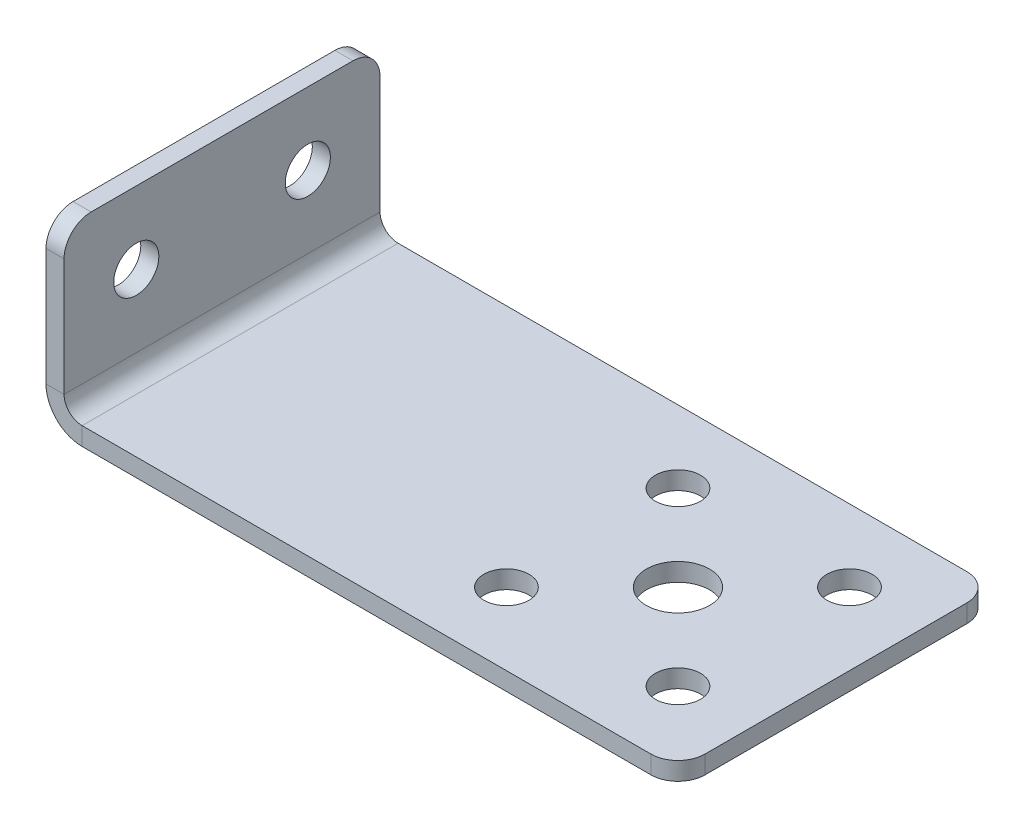
ISO-10303-21;
HEADER;
FILE_DESCRIPTION(('STEP AP214'),'2;1');
FILE_NAME('part.step','',(''),(''),'','','');
FILE_SCHEMA(('AUTOMOTIVE_DESIGN { 1 0 10303 214 1 1 1 1 }'));
ENDSEC;
DATA;
#1=APPLICATION_CONTEXT('core data for automotive mechanical design processes');
#2=APPLICATION_PROTOCOL_DEFINITION('international standard','automotive_design',2000,#1);
#3=PRODUCT_CONTEXT('',#1,'mechanical');
#4=PRODUCT('Part','Part','',(#3));
#5=PRODUCT_RELATED_PRODUCT_CATEGORY('part','',(#4));
#6=PRODUCT_DEFINITION_FORMATION('','',#4);
#7=PRODUCT_DEFINITION_CONTEXT('part definition',#1,'design');
#8=PRODUCT_DEFINITION('design','',#6,#7);
#9=PRODUCT_DEFINITION_SHAPE('','',#8);
#10=(LENGTH_UNIT() NAMED_UNIT(*) SI_UNIT(.MILLI.,.METRE.));
#11=(NAMED_UNIT(*) PLANE_ANGLE_UNIT() SI_UNIT($,.RADIAN.));
#12=(NAMED_UNIT(*) SI_UNIT($,.STERADIAN.) SOLID_ANGLE_UNIT());
#13=UNCERTAINTY_MEASURE_WITH_UNIT(LENGTH_MEASURE(1.E-05),#10,'distance_accuracy_value','');
#14=(GEOMETRIC_REPRESENTATION_CONTEXT(3) GLOBAL_UNCERTAINTY_ASSIGNED_CONTEXT((#13)) GLOBAL_UNIT_ASSIGNED_CONTEXT((#10,
#11,#12)) REPRESENTATION_CONTEXT('',''));
#15=CARTESIAN_POINT('',(0.,0.,0.));
#16=DIRECTION('',(0.,0.,1.));
#17=DIRECTION('',(1.,0.,0.));
#18=AXIS2_PLACEMENT_3D('',#15,#16,#17);
#19=CARTESIAN_POINT('',(35.,2.,17.5));
#20=DIRECTION('',(0.,0.,-1.));
#21=DIRECTION('',(-1.,0.,0.));
#22=AXIS2_PLACEMENT_3D('',#19,#20,#21);
#23=PLANE('',#22);
#24=DIRECTION('',(1.,0.,0.));
#25=VECTOR('',#24,1.);
#26=CARTESIAN_POINT('',(35.,0.,17.5));
#27=LINE('',#26,#25);
#28=CARTESIAN_POINT('',(-31.,0.,17.5));
#29=VERTEX_POINT('',#28);
#30=CARTESIAN_POINT('',(32.,0.,17.5));
#31=VERTEX_POINT('',#30);
#32=EDGE_CURVE('E225',#29,#31,#27,.T.);
#33=ORIENTED_EDGE('',*,*,#32,.T.);
#34=DIRECTION('',(0.,-1.,0.));
#35=VECTOR('',#34,1.);
#36=CARTESIAN_POINT('',(32.,2.,17.5));
#37=LINE('',#36,#35);
#38=CARTESIAN_POINT('',(32.,2.,17.5));
#39=VERTEX_POINT('',#38);
#40=EDGE_CURVE('E13',#31,#39,#37,.F.);
#41=ORIENTED_EDGE('',*,*,#40,.T.);
#42=DIRECTION('',(1.,0.,0.));
#43=VECTOR('',#42,1.);
#44=CARTESIAN_POINT('',(35.,2.,17.5));
#45=LINE('',#44,#43);
#46=CARTESIAN_POINT('',(-31.,2.,17.5));
#47=VERTEX_POINT('',#46);
#48=EDGE_CURVE('E228',#47,#39,#45,.T.);
#49=ORIENTED_EDGE('',*,*,#48,.F.);
#50=DIRECTION('',(0.,-1.,0.));
#51=VECTOR('',#50,1.);
#52=CARTESIAN_POINT('',(-31.,2.,17.5));
#53=LINE('',#52,#51);
#54=EDGE_CURVE('E210',#47,#29,#53,.T.);
#55=ORIENTED_EDGE('',*,*,#54,.T.);
#56=EDGE_LOOP('',(#33,#41,#49,#55));
#57=FACE_BOUND('',#56,.T.);
#58=ADVANCED_FACE('F65',(#57),#23,.F.);
#59=CARTESIAN_POINT('',(35.,2.,-17.5));
#60=DIRECTION('',(0.,0.,1.));
#61=DIRECTION('',(1.,0.,0.));
#62=AXIS2_PLACEMENT_3D('',#59,#60,#61);
#63=PLANE('',#62);
#64=DIRECTION('',(-1.,0.,0.));
#65=VECTOR('',#64,1.);
#66=CARTESIAN_POINT('',(35.,2.,-17.5));
#67=LINE('',#66,#65);
#68=CARTESIAN_POINT('',(32.,2.,-17.5));
#69=VERTEX_POINT('',#68);
#70=CARTESIAN_POINT('',(-31.,2.,-17.5));
#71=VERTEX_POINT('',#70);
#72=EDGE_CURVE('E237',#69,#71,#67,.T.);
#73=ORIENTED_EDGE('',*,*,#72,.F.);
#74=DIRECTION('',(0.,-1.,0.));
#75=VECTOR('',#74,1.);
#76=CARTESIAN_POINT('',(32.,2.,-17.5));
#77=LINE('',#76,#75);
#78=CARTESIAN_POINT('',(32.,0.,-17.5));
#79=VERTEX_POINT('',#78);
#80=EDGE_CURVE('E240',#69,#79,#77,.T.);
#81=ORIENTED_EDGE('',*,*,#80,.T.);
#82=DIRECTION('',(-1.,0.,0.));
#83=VECTOR('',#82,1.);
#84=CARTESIAN_POINT('',(35.,0.,-17.5));
#85=LINE('',#84,#83);
#86=CARTESIAN_POINT('',(-31.,0.,-17.5));
#87=VERTEX_POINT('',#86);
#88=EDGE_CURVE('E233',#79,#87,#85,.T.);
#89=ORIENTED_EDGE('',*,*,#88,.T.);
#90=DIRECTION('',(0.,-1.,0.));
#91=VECTOR('',#90,1.);
#92=CARTESIAN_POINT('',(-31.,2.,-17.5));
#93=LINE('',#92,#91);
#94=EDGE_CURVE('E221',#71,#87,#93,.T.);
#95=ORIENTED_EDGE('',*,*,#94,.F.);
#96=EDGE_LOOP('',(#73,#81,#89,#95));
#97=FACE_BOUND('',#96,.T.);
#98=ADVANCED_FACE('F428',(#97),#63,.F.);
#99=CARTESIAN_POINT('',(0.,2.,0.));
#100=DIRECTION('',(0.,1.,0.));
#101=DIRECTION('',(0.,0.,1.));
#102=AXIS2_PLACEMENT_3D('',#99,#100,#101);
#103=PLANE('',#102);
#104=CARTESIAN_POINT('',(17.5,2.,0.));
#105=DIRECTION('',(0.,1.,0.));
#106=DIRECTION('',(0.,0.,1.));
#107=AXIS2_PLACEMENT_3D('',#104,#105,#106);
#108=CIRCLE('',#107,3.5);
#109=CARTESIAN_POINT('',(17.5,2.,3.5));
#110=VERTEX_POINT('',#109);
#111=EDGE_CURVE('E377',#110,#110,#108,.T.);
#112=ORIENTED_EDGE('',*,*,#111,.F.);
#113=EDGE_LOOP('',(#112));
#114=FACE_BOUND('',#113,.T.);
#115=CARTESIAN_POINT('',(8.,2.,-9.50000000000001));
#116=DIRECTION('',(0.,1.,0.));
#117=DIRECTION('',(0.,0.,1.));
#118=AXIS2_PLACEMENT_3D('',#115,#116,#117);
#119=CIRCLE('',#118,2.49999999999999);
#120=CARTESIAN_POINT('',(8.,2.,-7.00000000000002));
#121=VERTEX_POINT('',#120);
#122=EDGE_CURVE('E369',#121,#121,#119,.T.);
#123=ORIENTED_EDGE('',*,*,#122,.F.);
#124=EDGE_LOOP('',(#123));
#125=FACE_BOUND('',#124,.T.);
#126=CARTESIAN_POINT('',(27.,2.,-9.50000000000001));
#127=DIRECTION('',(0.,1.,0.));
#128=DIRECTION('',(0.,0.,1.));
#129=AXIS2_PLACEMENT_3D('',#126,#127,#128);
#130=CIRCLE('',#129,2.49999999999999);
#131=CARTESIAN_POINT('',(27.,2.,-7.00000000000002));
#132=VERTEX_POINT('',#131);
#133=EDGE_CURVE('E361',#132,#132,#130,.T.);
#134=ORIENTED_EDGE('',*,*,#133,.F.);
#135=EDGE_LOOP('',(#134));
#136=FACE_BOUND('',#135,.T.);
#137=CARTESIAN_POINT('',(27.,2.,9.50000000000001));
#138=DIRECTION('',(0.,1.,0.));
#139=DIRECTION('',(0.,0.,1.));
#140=AXIS2_PLACEMENT_3D('',#137,#138,#139);
#141=CIRCLE('',#140,2.49999999999999);
#142=CARTESIAN_POINT('',(27.,2.,12.));
#143=VERTEX_POINT('',#142);
#144=EDGE_CURVE('E353',#143,#143,#141,.T.);
#145=ORIENTED_EDGE('',*,*,#144,.F.);
#146=EDGE_LOOP('',(#145));
#147=FACE_BOUND('',#146,.T.);
#148=CARTESIAN_POINT('',(8.,2.,9.50000000000002));
#149=DIRECTION('',(0.,1.,0.));
#150=DIRECTION('',(0.,0.,1.));
#151=AXIS2_PLACEMENT_3D('',#148,#149,#150);
#152=CIRCLE('',#151,2.49999999999999);
#153=CARTESIAN_POINT('',(8.,2.,12.));
#154=VERTEX_POINT('',#153);
#155=EDGE_CURVE('E345',#154,#154,#152,.T.);
#156=ORIENTED_EDGE('',*,*,#155,.F.);
#157=EDGE_LOOP('',(#156));
#158=FACE_BOUND('',#157,.T.);
#159=DIRECTION('',(0.,0.,-1.));
#160=VECTOR('',#159,1.);
#161=CARTESIAN_POINT('',(35.,2.,17.5));
#162=LINE('',#161,#160);
#163=CARTESIAN_POINT('',(35.,2.,14.5));
#164=VERTEX_POINT('',#163);
#165=CARTESIAN_POINT('',(35.,2.,-14.5));
#166=VERTEX_POINT('',#165);
#167=EDGE_CURVE('E232',#164,#166,#162,.T.);
#168=ORIENTED_EDGE('',*,*,#167,.T.);
#169=CARTESIAN_POINT('',(32.,2.,-14.5));
#170=DIRECTION('',(0.,1.,0.));
#171=DIRECTION('',(0.,0.,1.));
#172=AXIS2_PLACEMENT_3D('',#169,#170,#171);
#173=CIRCLE('',#172,3.);
#174=EDGE_CURVE('E269',#166,#69,#173,.T.);
#175=ORIENTED_EDGE('',*,*,#174,.T.);
#176=ORIENTED_EDGE('',*,*,#72,.T.);
#177=DIRECTION('',(0.,0.,1.));
#178=VECTOR('',#177,1.);
#179=CARTESIAN_POINT('',(-31.,2.,17.5));
#180=LINE('',#179,#178);
#181=EDGE_CURVE('E215',#47,#71,#180,.F.);
#182=ORIENTED_EDGE('',*,*,#181,.F.);
#183=ORIENTED_EDGE('',*,*,#48,.T.);
#184=CARTESIAN_POINT('',(32.,2.,14.5));
#185=DIRECTION('',(0.,1.,0.));
#186=DIRECTION('',(0.,0.,1.));
#187=AXIS2_PLACEMENT_3D('',#184,#185,#186);
#188=CIRCLE('',#187,3.);
#189=EDGE_CURVE('E266',#39,#164,#188,.T.);
#190=ORIENTED_EDGE('',*,*,#189,.T.);
#191=EDGE_LOOP('',(#168,#175,#176,#182,#183,#190));
#192=FACE_BOUND('',#191,.T.);
#193=ADVANCED_FACE('F443',(#114,#125,#136,#147,#158,#192),#103,.T.);
#194=CARTESIAN_POINT('',(0.,0.,0.));
#195=DIRECTION('',(0.,1.,0.));
#196=DIRECTION('',(0.,0.,1.));
#197=AXIS2_PLACEMENT_3D('',#194,#195,#196);
#198=PLANE('',#197);
#199=CARTESIAN_POINT('',(17.5,0.,0.));
#200=DIRECTION('',(0.,1.,0.));
#201=DIRECTION('',(0.,0.,1.));
#202=AXIS2_PLACEMENT_3D('',#199,#200,#201);
#203=CIRCLE('',#202,3.5);
#204=CARTESIAN_POINT('',(17.5,0.,3.5));
#205=VERTEX_POINT('',#204);
#206=EDGE_CURVE('E373',#205,#205,#203,.T.);
#207=ORIENTED_EDGE('',*,*,#206,.T.);
#208=EDGE_LOOP('',(#207));
#209=FACE_BOUND('',#208,.T.);
#210=CARTESIAN_POINT('',(8.,0.,-9.50000000000001));
#211=DIRECTION('',(0.,1.,0.));
#212=DIRECTION('',(0.,0.,1.));
#213=AXIS2_PLACEMENT_3D('',#210,#211,#212);
#214=CIRCLE('',#213,2.5);
#215=CARTESIAN_POINT('',(8.,0.,-7.00000000000001));
#216=VERTEX_POINT('',#215);
#217=EDGE_CURVE('E365',#216,#216,#214,.T.);
#218=ORIENTED_EDGE('',*,*,#217,.T.);
#219=EDGE_LOOP('',(#218));
#220=FACE_BOUND('',#219,.T.);
#221=CARTESIAN_POINT('',(27.,0.,-9.50000000000001));
#222=DIRECTION('',(0.,1.,0.));
#223=DIRECTION('',(0.,0.,1.));
#224=AXIS2_PLACEMENT_3D('',#221,#222,#223);
#225=CIRCLE('',#224,2.5);
#226=CARTESIAN_POINT('',(27.,0.,-7.00000000000001));
#227=VERTEX_POINT('',#226);
#228=EDGE_CURVE('E357',#227,#227,#225,.T.);
#229=ORIENTED_EDGE('',*,*,#228,.T.);
#230=EDGE_LOOP('',(#229));
#231=FACE_BOUND('',#230,.T.);
#232=CARTESIAN_POINT('',(27.,0.,9.50000000000001));
#233=DIRECTION('',(0.,1.,0.));
#234=DIRECTION('',(0.,0.,1.));
#235=AXIS2_PLACEMENT_3D('',#232,#233,#234);
#236=CIRCLE('',#235,2.5);
#237=CARTESIAN_POINT('',(27.,0.,12.));
#238=VERTEX_POINT('',#237);
#239=EDGE_CURVE('E349',#238,#238,#236,.T.);
#240=ORIENTED_EDGE('',*,*,#239,.T.);
#241=EDGE_LOOP('',(#240));
#242=FACE_BOUND('',#241,.T.);
#243=CARTESIAN_POINT('',(8.,0.,9.50000000000002));
#244=DIRECTION('',(0.,1.,0.));
#245=DIRECTION('',(0.,0.,1.));
#246=AXIS2_PLACEMENT_3D('',#243,#244,#245);
#247=CIRCLE('',#246,2.5);
#248=CARTESIAN_POINT('',(8.,0.,12.));
#249=VERTEX_POINT('',#248);
#250=EDGE_CURVE('E205',#249,#249,#247,.T.);
#251=ORIENTED_EDGE('',*,*,#250,.T.);
#252=EDGE_LOOP('',(#251));
#253=FACE_BOUND('',#252,.T.);
#254=ORIENTED_EDGE('',*,*,#88,.F.);
#255=CARTESIAN_POINT('',(32.,0.,-14.5));
#256=DIRECTION('',(0.,1.,0.));
#257=DIRECTION('',(0.,0.,1.));
#258=AXIS2_PLACEMENT_3D('',#255,#256,#257);
#259=CIRCLE('',#258,3.);
#260=CARTESIAN_POINT('',(35.,0.,-14.5));
#261=VERTEX_POINT('',#260);
#262=EDGE_CURVE('E256',#79,#261,#259,.F.);
#263=ORIENTED_EDGE('',*,*,#262,.T.);
#264=DIRECTION('',(0.,0.,-1.));
#265=VECTOR('',#264,1.);
#266=CARTESIAN_POINT('',(35.,0.,17.5));
#267=LINE('',#266,#265);
#268=CARTESIAN_POINT('',(35.,0.,14.5));
#269=VERTEX_POINT('',#268);
#270=EDGE_CURVE('E244',#269,#261,#267,.T.);
#271=ORIENTED_EDGE('',*,*,#270,.F.);
#272=CARTESIAN_POINT('',(32.,0.,14.5));
#273=DIRECTION('',(0.,1.,0.));
#274=DIRECTION('',(0.,0.,1.));
#275=AXIS2_PLACEMENT_3D('',#272,#273,#274);
#276=CIRCLE('',#275,3.);
#277=EDGE_CURVE('E253',#269,#31,#276,.F.);
#278=ORIENTED_EDGE('',*,*,#277,.T.);
#279=ORIENTED_EDGE('',*,*,#32,.F.);
#280=DIRECTION('',(0.,0.,1.));
#281=VECTOR('',#280,1.);
#282=CARTESIAN_POINT('',(-31.,0.,17.5));
#283=LINE('',#282,#281);
#284=EDGE_CURVE('E172',#29,#87,#283,.F.);
#285=ORIENTED_EDGE('',*,*,#284,.T.);
#286=EDGE_LOOP('',(#254,#263,#271,#278,#279,#285));
#287=FACE_BOUND('',#286,.T.);
#288=ADVANCED_FACE('F433',(#209,#220,#231,#242,#253,#287),#198,.F.);
#289=CARTESIAN_POINT('',(35.,2.,17.5));
#290=DIRECTION('',(-1.,0.,0.));
#291=DIRECTION('',(0.,0.,1.));
#292=AXIS2_PLACEMENT_3D('',#289,#290,#291);
#293=PLANE('',#292);
#294=ORIENTED_EDGE('',*,*,#270,.T.);
#295=DIRECTION('',(0.,-1.,0.));
#296=VECTOR('',#295,1.);
#297=CARTESIAN_POINT('',(35.,2.,-14.5));
#298=LINE('',#297,#296);
#299=EDGE_CURVE('E263',#261,#166,#298,.F.);
#300=ORIENTED_EDGE('',*,*,#299,.T.);
#301=ORIENTED_EDGE('',*,*,#167,.F.);
#302=DIRECTION('',(0.,-1.,0.));
#303=VECTOR('',#302,1.);
#304=CARTESIAN_POINT('',(35.,2.,14.5));
#305=LINE('',#304,#303);
#306=EDGE_CURVE('E259',#164,#269,#305,.T.);
#307=ORIENTED_EDGE('',*,*,#306,.T.);
#308=EDGE_LOOP('',(#294,#300,#301,#307));
#309=FACE_BOUND('',#308,.T.);
#310=ADVANCED_FACE('F446',(#309),#293,.F.);
#311=CARTESIAN_POINT('',(-31.,4.,-17.5));
#312=DIRECTION('',(0.,0.,-1.));
#313=DIRECTION('',(-1.,0.,0.));
#314=AXIS2_PLACEMENT_3D('',#311,#312,#313);
#315=PLANE('',#314);
#316=DIRECTION('',(-1.,0.,0.));
#317=VECTOR('',#316,1.);
#318=CARTESIAN_POINT('',(-35.,3.99999999999999,-17.5));
#319=LINE('',#318,#317);
#320=CARTESIAN_POINT('',(-33.,4.,-17.5));
#321=VERTEX_POINT('',#320);
#322=CARTESIAN_POINT('',(-35.,3.99999999999999,-17.5));
#323=VERTEX_POINT('',#322);
#324=EDGE_CURVE('E201',#321,#323,#319,.T.);
#325=ORIENTED_EDGE('',*,*,#324,.F.);
#326=CARTESIAN_POINT('',(-31.,4.,-17.5));
#327=DIRECTION('',(0.,0.,1.));
#328=DIRECTION('',(1.,0.,0.));
#329=AXIS2_PLACEMENT_3D('',#326,#327,#328);
#330=CIRCLE('',#329,2.);
#331=EDGE_CURVE('E176',#71,#321,#330,.F.);
#332=ORIENTED_EDGE('',*,*,#331,.F.);
#333=ORIENTED_EDGE('',*,*,#94,.T.);
#334=CARTESIAN_POINT('',(-31.,4.,-17.5));
#335=DIRECTION('',(0.,0.,1.));
#336=DIRECTION('',(1.,0.,0.));
#337=AXIS2_PLACEMENT_3D('',#334,#335,#336);
#338=CIRCLE('',#337,4.);
#339=EDGE_CURVE('E208',#87,#323,#338,.F.);
#340=ORIENTED_EDGE('',*,*,#339,.T.);
#341=EDGE_LOOP('',(#325,#332,#333,#340));
#342=FACE_BOUND('',#341,.T.);
#343=ADVANCED_FACE('F424',(#342),#315,.T.);
#344=CARTESIAN_POINT('',(-31.,4.,17.5));
#345=DIRECTION('',(0.,0.,-1.));
#346=DIRECTION('',(-1.,0.,0.));
#347=AXIS2_PLACEMENT_3D('',#344,#345,#346);
#348=PLANE('',#347);
#349=CARTESIAN_POINT('',(-31.,4.,17.5));
#350=DIRECTION('',(0.,0.,1.));
#351=DIRECTION('',(1.,0.,0.));
#352=AXIS2_PLACEMENT_3D('',#349,#350,#351);
#353=CIRCLE('',#352,2.);
#354=CARTESIAN_POINT('',(-33.,4.,17.5));
#355=VERTEX_POINT('',#354);
#356=EDGE_CURVE('E160',#355,#47,#353,.T.);
#357=ORIENTED_EDGE('',*,*,#356,.F.);
#358=DIRECTION('',(-1.,0.,0.));
#359=VECTOR('',#358,1.);
#360=CARTESIAN_POINT('',(-33.,4.,17.5));
#361=LINE('',#360,#359);
#362=CARTESIAN_POINT('',(-35.,3.99999999999999,17.5));
#363=VERTEX_POINT('',#362);
#364=EDGE_CURVE('E157',#355,#363,#361,.T.);
#365=ORIENTED_EDGE('',*,*,#364,.T.);
#366=CARTESIAN_POINT('',(-31.,4.,17.5));
#367=DIRECTION('',(0.,0.,1.));
#368=DIRECTION('',(1.,0.,0.));
#369=AXIS2_PLACEMENT_3D('',#366,#367,#368);
#370=CIRCLE('',#369,4.);
#371=EDGE_CURVE('E166',#363,#29,#370,.T.);
#372=ORIENTED_EDGE('',*,*,#371,.T.);
#373=ORIENTED_EDGE('',*,*,#54,.F.);
#374=EDGE_LOOP('',(#357,#365,#372,#373));
#375=FACE_BOUND('',#374,.T.);
#376=ADVANCED_FACE('F179',(#375),#348,.F.);
#377=CARTESIAN_POINT('',(-31.,4.,17.5));
#378=DIRECTION('',(0.,0.,1.));
#379=DIRECTION('',(-1.,0.,0.));
#380=AXIS2_PLACEMENT_3D('',#377,#378,#379);
#381=CYLINDRICAL_SURFACE('',#380,4.);
#382=ORIENTED_EDGE('',*,*,#284,.F.);
#383=ORIENTED_EDGE('',*,*,#371,.F.);
#384=DIRECTION('',(0.,0.,1.));
#385=VECTOR('',#384,1.);
#386=CARTESIAN_POINT('',(-35.,3.99999999999999,0.));
#387=LINE('',#386,#385);
#388=EDGE_CURVE('E169',#323,#363,#387,.T.);
#389=ORIENTED_EDGE('',*,*,#388,.F.);
#390=ORIENTED_EDGE('',*,*,#339,.F.);
#391=EDGE_LOOP('',(#382,#383,#389,#390));
#392=FACE_BOUND('',#391,.T.);
#393=ADVANCED_FACE('F167',(#392),#381,.T.);
#394=CARTESIAN_POINT('',(-31.,4.,17.5));
#395=DIRECTION('',(0.,0.,1.));
#396=DIRECTION('',(-1.,0.,0.));
#397=AXIS2_PLACEMENT_3D('',#394,#395,#396);
#398=CYLINDRICAL_SURFACE('',#397,2.);
#399=ORIENTED_EDGE('',*,*,#181,.T.);
#400=ORIENTED_EDGE('',*,*,#331,.T.);
#401=DIRECTION('',(0.,0.,-1.));
#402=VECTOR('',#401,1.);
#403=CARTESIAN_POINT('',(-33.,4.,-17.5));
#404=LINE('',#403,#402);
#405=EDGE_CURVE('E182',#321,#355,#404,.F.);
#406=ORIENTED_EDGE('',*,*,#405,.T.);
#407=ORIENTED_EDGE('',*,*,#356,.T.);
#408=EDGE_LOOP('',(#399,#400,#406,#407));
#409=FACE_BOUND('',#408,.T.);
#410=ADVANCED_FACE('F421',(#409),#398,.F.);
#411=CARTESIAN_POINT('',(-35.,1.99999999999999,17.5));
#412=DIRECTION('',(0.,0.,1.));
#413=DIRECTION('',(1.,0.,0.));
#414=AXIS2_PLACEMENT_3D('',#411,#412,#413);
#415=PLANE('',#414);
#416=DIRECTION('',(0.,1.,0.));
#417=VECTOR('',#416,1.);
#418=CARTESIAN_POINT('',(-33.,-1.21430643318376E-13,17.5));
#419=LINE('',#418,#417);
#420=CARTESIAN_POINT('',(-33.0000000000001,17.,17.5));
#421=VERTEX_POINT('',#420);
#422=EDGE_CURVE('E331',#421,#355,#419,.F.);
#423=ORIENTED_EDGE('',*,*,#422,.F.);
#424=DIRECTION('',(1.,0.,0.));
#425=VECTOR('',#424,1.);
#426=CARTESIAN_POINT('',(-35.0000000000001,17.,17.5));
#427=LINE('',#426,#425);
#428=CARTESIAN_POINT('',(-35.0000000000001,17.,17.5));
#429=VERTEX_POINT('',#428);
#430=EDGE_CURVE('E74',#421,#429,#427,.F.);
#431=ORIENTED_EDGE('',*,*,#430,.T.);
#432=DIRECTION('',(0.,-1.,0.));
#433=VECTOR('',#432,1.);
#434=CARTESIAN_POINT('',(-35.,1.99999999999999,17.5));
#435=LINE('',#434,#433);
#436=EDGE_CURVE('E153',#429,#363,#435,.T.);
#437=ORIENTED_EDGE('',*,*,#436,.T.);
#438=ORIENTED_EDGE('',*,*,#364,.F.);
#439=EDGE_LOOP('',(#423,#431,#437,#438));
#440=FACE_BOUND('',#439,.T.);
#441=ADVANCED_FACE('F155',(#440),#415,.T.);
#442=CARTESIAN_POINT('',(-35.0000000000001,20.,-17.5));
#443=DIRECTION('',(0.,0.,-1.));
#444=DIRECTION('',(-1.,0.,0.));
#445=AXIS2_PLACEMENT_3D('',#442,#443,#444);
#446=PLANE('',#445);
#447=DIRECTION('',(0.,1.,0.));
#448=VECTOR('',#447,1.);
#449=CARTESIAN_POINT('',(-35.0000000000001,20.,-17.5));
#450=LINE('',#449,#448);
#451=CARTESIAN_POINT('',(-35.0000000000001,17.,-17.5));
#452=VERTEX_POINT('',#451);
#453=EDGE_CURVE('E187',#323,#452,#450,.T.);
#454=ORIENTED_EDGE('',*,*,#453,.T.);
#455=DIRECTION('',(1.,0.,0.));
#456=VECTOR('',#455,1.);
#457=CARTESIAN_POINT('',(-35.,17.,-17.5));
#458=LINE('',#457,#456);
#459=CARTESIAN_POINT('',(-33.0000000000001,17.,-17.5));
#460=VERTEX_POINT('',#459);
#461=EDGE_CURVE('E272',#452,#460,#458,.T.);
#462=ORIENTED_EDGE('',*,*,#461,.T.);
#463=DIRECTION('',(0.,-1.,0.));
#464=VECTOR('',#463,1.);
#465=CARTESIAN_POINT('',(-33.,-1.21430643318376E-13,-17.5));
#466=LINE('',#465,#464);
#467=EDGE_CURVE('E189',#321,#460,#466,.F.);
#468=ORIENTED_EDGE('',*,*,#467,.F.);
#469=ORIENTED_EDGE('',*,*,#324,.T.);
#470=EDGE_LOOP('',(#454,#462,#468,#469));
#471=FACE_BOUND('',#470,.T.);
#472=ADVANCED_FACE('F410',(#471),#446,.T.);
#473=CARTESIAN_POINT('',(-35.,-1.28413605996063E-13,0.));
#474=DIRECTION('',(-1.,0.,0.));
#475=DIRECTION('',(0.,-1.,0.));
#476=AXIS2_PLACEMENT_3D('',#473,#474,#475);
#477=PLANE('',#476);
#478=CARTESIAN_POINT('',(-35.0000000000001,12.,9.50000000000002));
#479=DIRECTION('',(1.,0.,0.));
#480=DIRECTION('',(0.,0.,-1.));
#481=AXIS2_PLACEMENT_3D('',#478,#479,#480);
#482=CIRCLE('',#481,2.5);
#483=CARTESIAN_POINT('',(-35.0000000000001,12.,7.00000000000002));
#484=VERTEX_POINT('',#483);
#485=EDGE_CURVE('E389',#484,#484,#482,.T.);
#486=ORIENTED_EDGE('',*,*,#485,.T.);
#487=EDGE_LOOP('',(#486));
#488=FACE_BOUND('',#487,.T.);
#489=CARTESIAN_POINT('',(-35.0000000000001,12.,-9.50000000000001));
#490=DIRECTION('',(1.,0.,0.));
#491=DIRECTION('',(0.,0.,-1.));
#492=AXIS2_PLACEMENT_3D('',#489,#490,#491);
#493=CIRCLE('',#492,2.5);
#494=CARTESIAN_POINT('',(-35.0000000000001,12.,-12.));
#495=VERTEX_POINT('',#494);
#496=EDGE_CURVE('E381',#495,#495,#493,.T.);
#497=ORIENTED_EDGE('',*,*,#496,.T.);
#498=EDGE_LOOP('',(#497));
#499=FACE_BOUND('',#498,.T.);
#500=DIRECTION('',(0.,0.,1.));
#501=VECTOR('',#500,1.);
#502=CARTESIAN_POINT('',(-35.0000000000001,20.,17.5));
#503=LINE('',#502,#501);
#504=CARTESIAN_POINT('',(-35.0000000000001,20.,-14.5));
#505=VERTEX_POINT('',#504);
#506=CARTESIAN_POINT('',(-35.0000000000001,20.,14.5));
#507=VERTEX_POINT('',#506);
#508=EDGE_CURVE('E161',#505,#507,#503,.T.);
#509=ORIENTED_EDGE('',*,*,#508,.F.);
#510=CARTESIAN_POINT('',(-35.0000000000001,17.,-14.5));
#511=DIRECTION('',(-1.,0.,0.));
#512=DIRECTION('',(0.,-1.,0.));
#513=AXIS2_PLACEMENT_3D('',#510,#511,#512);
#514=CIRCLE('',#513,3.);
#515=EDGE_CURVE('E291',#505,#452,#514,.T.);
#516=ORIENTED_EDGE('',*,*,#515,.T.);
#517=ORIENTED_EDGE('',*,*,#453,.F.);
#518=ORIENTED_EDGE('',*,*,#388,.T.);
#519=ORIENTED_EDGE('',*,*,#436,.F.);
#520=CARTESIAN_POINT('',(-35.0000000000001,17.,14.5));
#521=DIRECTION('',(-1.,0.,0.));
#522=DIRECTION('',(0.,-1.,0.));
#523=AXIS2_PLACEMENT_3D('',#520,#521,#522);
#524=CIRCLE('',#523,3.);
#525=EDGE_CURVE('E87',#429,#507,#524,.T.);
#526=ORIENTED_EDGE('',*,*,#525,.T.);
#527=EDGE_LOOP('',(#509,#516,#517,#518,#519,#526));
#528=FACE_BOUND('',#527,.T.);
#529=ADVANCED_FACE('F185',(#488,#499,#528),#477,.T.);
#530=CARTESIAN_POINT('',(-33.,-1.21430643318376E-13,0.));
#531=DIRECTION('',(-1.,0.,0.));
#532=DIRECTION('',(0.,-1.,0.));
#533=AXIS2_PLACEMENT_3D('',#530,#531,#532);
#534=PLANE('',#533);
#535=CARTESIAN_POINT('',(-33.,12.,9.50000000000002));
#536=DIRECTION('',(1.,0.,0.));
#537=DIRECTION('',(0.,0.,-1.));
#538=AXIS2_PLACEMENT_3D('',#535,#536,#537);
#539=CIRCLE('',#538,2.5);
#540=CARTESIAN_POINT('',(-33.,12.,7.00000000000002));
#541=VERTEX_POINT('',#540);
#542=EDGE_CURVE('E393',#541,#541,#539,.T.);
#543=ORIENTED_EDGE('',*,*,#542,.F.);
#544=EDGE_LOOP('',(#543));
#545=FACE_BOUND('',#544,.T.);
#546=CARTESIAN_POINT('',(-33.,12.,-9.50000000000001));
#547=DIRECTION('',(1.,0.,0.));
#548=DIRECTION('',(0.,0.,-1.));
#549=AXIS2_PLACEMENT_3D('',#546,#547,#548);
#550=CIRCLE('',#549,2.5);
#551=CARTESIAN_POINT('',(-33.,12.,-12.));
#552=VERTEX_POINT('',#551);
#553=EDGE_CURVE('E385',#552,#552,#550,.T.);
#554=ORIENTED_EDGE('',*,*,#553,.F.);
#555=EDGE_LOOP('',(#554));
#556=FACE_BOUND('',#555,.T.);
#557=ORIENTED_EDGE('',*,*,#467,.T.);
#558=CARTESIAN_POINT('',(-33.0000000000001,17.,-14.5));
#559=DIRECTION('',(-1.,0.,0.));
#560=DIRECTION('',(0.,-1.,0.));
#561=AXIS2_PLACEMENT_3D('',#558,#559,#560);
#562=CIRCLE('',#561,3.);
#563=CARTESIAN_POINT('',(-33.0000000000001,20.,-14.5));
#564=VERTEX_POINT('',#563);
#565=EDGE_CURVE('E279',#460,#564,#562,.F.);
#566=ORIENTED_EDGE('',*,*,#565,.T.);
#567=DIRECTION('',(0.,0.,-1.));
#568=VECTOR('',#567,1.);
#569=CARTESIAN_POINT('',(-33.0000000000001,20.,0.));
#570=LINE('',#569,#568);
#571=CARTESIAN_POINT('',(-33.0000000000001,20.,14.5));
#572=VERTEX_POINT('',#571);
#573=EDGE_CURVE('E194',#564,#572,#570,.F.);
#574=ORIENTED_EDGE('',*,*,#573,.T.);
#575=CARTESIAN_POINT('',(-33.0000000000001,17.,14.5));
#576=DIRECTION('',(-1.,0.,0.));
#577=DIRECTION('',(0.,-1.,0.));
#578=AXIS2_PLACEMENT_3D('',#575,#576,#577);
#579=CIRCLE('',#578,3.);
#580=EDGE_CURVE('E276',#572,#421,#579,.F.);
#581=ORIENTED_EDGE('',*,*,#580,.T.);
#582=ORIENTED_EDGE('',*,*,#422,.T.);
#583=ORIENTED_EDGE('',*,*,#405,.F.);
#584=EDGE_LOOP('',(#557,#566,#574,#581,#582,#583));
#585=FACE_BOUND('',#584,.T.);
#586=ADVANCED_FACE('F401',(#545,#556,#585),#534,.F.);
#587=CARTESIAN_POINT('',(-35.0000000000001,20.,17.5));
#588=DIRECTION('',(0.,1.,0.));
#589=DIRECTION('',(-1.,0.,0.));
#590=AXIS2_PLACEMENT_3D('',#587,#588,#589);
#591=PLANE('',#590);
#592=ORIENTED_EDGE('',*,*,#573,.F.);
#593=DIRECTION('',(1.,0.,0.));
#594=VECTOR('',#593,1.);
#595=CARTESIAN_POINT('',(-35.0000000000001,20.,-14.5));
#596=LINE('',#595,#594);
#597=EDGE_CURVE('E286',#564,#505,#596,.F.);
#598=ORIENTED_EDGE('',*,*,#597,.T.);
#599=ORIENTED_EDGE('',*,*,#508,.T.);
#600=DIRECTION('',(1.,0.,0.));
#601=VECTOR('',#600,1.);
#602=CARTESIAN_POINT('',(-35.0000000000001,20.,14.5));
#603=LINE('',#602,#601);
#604=EDGE_CURVE('E282',#507,#572,#603,.T.);
#605=ORIENTED_EDGE('',*,*,#604,.T.);
#606=EDGE_LOOP('',(#592,#598,#599,#605));
#607=FACE_BOUND('',#606,.T.);
#608=ADVANCED_FACE('F404',(#607),#591,.T.);
#609=CARTESIAN_POINT('',(8.,2.,9.50000000000002));
#610=DIRECTION('',(0.,1.,0.));
#611=DIRECTION('',(0.,0.,1.));
#612=AXIS2_PLACEMENT_3D('',#609,#610,#611);
#613=CYLINDRICAL_SURFACE('',#612,2.49999999999999);
#614=ORIENTED_EDGE('',*,*,#250,.F.);
#615=EDGE_LOOP('',(#614));
#616=FACE_BOUND('',#615,.T.);
#617=ORIENTED_EDGE('',*,*,#155,.T.);
#618=EDGE_LOOP('',(#617));
#619=FACE_BOUND('',#618,.T.);
#620=ADVANCED_FACE('F487',(#616,#619),#613,.F.);
#621=CARTESIAN_POINT('',(27.,2.,9.50000000000001));
#622=DIRECTION('',(0.,1.,0.));
#623=DIRECTION('',(0.,0.,1.));
#624=AXIS2_PLACEMENT_3D('',#621,#622,#623);
#625=CYLINDRICAL_SURFACE('',#624,2.49999999999999);
#626=ORIENTED_EDGE('',*,*,#239,.F.);
#627=EDGE_LOOP('',(#626));
#628=FACE_BOUND('',#627,.T.);
#629=ORIENTED_EDGE('',*,*,#144,.T.);
#630=EDGE_LOOP('',(#629));
#631=FACE_BOUND('',#630,.T.);
#632=ADVANCED_FACE('F495',(#628,#631),#625,.F.);
#633=CARTESIAN_POINT('',(27.,2.,-9.50000000000001));
#634=DIRECTION('',(0.,1.,0.));
#635=DIRECTION('',(0.,0.,1.));
#636=AXIS2_PLACEMENT_3D('',#633,#634,#635);
#637=CYLINDRICAL_SURFACE('',#636,2.49999999999999);
#638=ORIENTED_EDGE('',*,*,#228,.F.);
#639=EDGE_LOOP('',(#638));
#640=FACE_BOUND('',#639,.T.);
#641=ORIENTED_EDGE('',*,*,#133,.T.);
#642=EDGE_LOOP('',(#641));
#643=FACE_BOUND('',#642,.T.);
#644=ADVANCED_FACE('F499',(#640,#643),#637,.F.);
#645=CARTESIAN_POINT('',(8.,2.,-9.50000000000001));
#646=DIRECTION('',(0.,1.,0.));
#647=DIRECTION('',(0.,0.,1.));
#648=AXIS2_PLACEMENT_3D('',#645,#646,#647);
#649=CYLINDRICAL_SURFACE('',#648,2.49999999999999);
#650=ORIENTED_EDGE('',*,*,#217,.F.);
#651=EDGE_LOOP('',(#650));
#652=FACE_BOUND('',#651,.T.);
#653=ORIENTED_EDGE('',*,*,#122,.T.);
#654=EDGE_LOOP('',(#653));
#655=FACE_BOUND('',#654,.T.);
#656=ADVANCED_FACE('F503',(#652,#655),#649,.F.);
#657=CARTESIAN_POINT('',(17.5,2.,0.));
#658=DIRECTION('',(0.,1.,0.));
#659=DIRECTION('',(0.,0.,1.));
#660=AXIS2_PLACEMENT_3D('',#657,#658,#659);
#661=CYLINDRICAL_SURFACE('',#660,3.5);
#662=ORIENTED_EDGE('',*,*,#206,.F.);
#663=EDGE_LOOP('',(#662));
#664=FACE_BOUND('',#663,.T.);
#665=ORIENTED_EDGE('',*,*,#111,.T.);
#666=EDGE_LOOP('',(#665));
#667=FACE_BOUND('',#666,.T.);
#668=ADVANCED_FACE('F507',(#664,#667),#661,.F.);
#669=CARTESIAN_POINT('',(-33.,12.,-9.50000000000001));
#670=DIRECTION('',(1.,0.,0.));
#671=DIRECTION('',(0.,0.,-1.));
#672=AXIS2_PLACEMENT_3D('',#669,#670,#671);
#673=CYLINDRICAL_SURFACE('',#672,2.5);
#674=ORIENTED_EDGE('',*,*,#496,.F.);
#675=EDGE_LOOP('',(#674));
#676=FACE_BOUND('',#675,.T.);
#677=ORIENTED_EDGE('',*,*,#553,.T.);
#678=EDGE_LOOP('',(#677));
#679=FACE_BOUND('',#678,.T.);
#680=ADVANCED_FACE('F458',(#676,#679),#673,.F.);
#681=CARTESIAN_POINT('',(-33.,12.,9.50000000000002));
#682=DIRECTION('',(1.,0.,0.));
#683=DIRECTION('',(0.,0.,-1.));
#684=AXIS2_PLACEMENT_3D('',#681,#682,#683);
#685=CYLINDRICAL_SURFACE('',#684,2.5);
#686=ORIENTED_EDGE('',*,*,#485,.F.);
#687=EDGE_LOOP('',(#686));
#688=FACE_BOUND('',#687,.T.);
#689=ORIENTED_EDGE('',*,*,#542,.T.);
#690=EDGE_LOOP('',(#689));
#691=FACE_BOUND('',#690,.T.);
#692=ADVANCED_FACE('F399',(#688,#691),#685,.F.);
#693=CARTESIAN_POINT('',(32.,2.,-14.5));
#694=DIRECTION('',(0.,-1.,0.));
#695=DIRECTION('',(0.,0.,-1.));
#696=AXIS2_PLACEMENT_3D('',#693,#694,#695);
#697=CYLINDRICAL_SURFACE('',#696,3.);
#698=ORIENTED_EDGE('',*,*,#174,.F.);
#699=ORIENTED_EDGE('',*,*,#299,.F.);
#700=ORIENTED_EDGE('',*,*,#262,.F.);
#701=ORIENTED_EDGE('',*,*,#80,.F.);
#702=EDGE_LOOP('',(#698,#699,#700,#701));
#703=FACE_BOUND('',#702,.T.);
#704=ADVANCED_FACE('F449',(#703),#697,.T.);
#705=CARTESIAN_POINT('',(-35.,17.,-14.5));
#706=DIRECTION('',(1.,0.,0.));
#707=DIRECTION('',(0.,1.,0.));
#708=AXIS2_PLACEMENT_3D('',#705,#706,#707);
#709=CYLINDRICAL_SURFACE('',#708,3.);
#710=ORIENTED_EDGE('',*,*,#515,.F.);
#711=ORIENTED_EDGE('',*,*,#597,.F.);
#712=ORIENTED_EDGE('',*,*,#565,.F.);
#713=ORIENTED_EDGE('',*,*,#461,.F.);
#714=EDGE_LOOP('',(#710,#711,#712,#713));
#715=FACE_BOUND('',#714,.T.);
#716=ADVANCED_FACE('F414',(#715),#709,.T.);
#717=CARTESIAN_POINT('',(-35.,17.,14.5));
#718=DIRECTION('',(1.,0.,0.));
#719=DIRECTION('',(0.,1.,0.));
#720=AXIS2_PLACEMENT_3D('',#717,#718,#719);
#721=CYLINDRICAL_SURFACE('',#720,3.);
#722=ORIENTED_EDGE('',*,*,#525,.F.);
#723=ORIENTED_EDGE('',*,*,#430,.F.);
#724=ORIENTED_EDGE('',*,*,#580,.F.);
#725=ORIENTED_EDGE('',*,*,#604,.F.);
#726=EDGE_LOOP('',(#722,#723,#724,#725));
#727=FACE_BOUND('',#726,.T.);
#728=ADVANCED_FACE('F419',(#727),#721,.T.);
#729=CARTESIAN_POINT('',(32.,2.,14.5));
#730=DIRECTION('',(0.,-1.,0.));
#731=DIRECTION('',(0.,0.,-1.));
#732=AXIS2_PLACEMENT_3D('',#729,#730,#731);
#733=CYLINDRICAL_SURFACE('',#732,3.);
#734=ORIENTED_EDGE('',*,*,#189,.F.);
#735=ORIENTED_EDGE('',*,*,#40,.F.);
#736=ORIENTED_EDGE('',*,*,#277,.F.);
#737=ORIENTED_EDGE('',*,*,#306,.F.);
#738=EDGE_LOOP('',(#734,#735,#736,#737));
#739=FACE_BOUND('',#738,.T.);
#740=ADVANCED_FACE('F67',(#739),#733,.T.);
#741=CLOSED_SHELL('',(#58,#98,#193,#288,#310,#343,#376,#393,#410,#441,#472,#529,#586,#608,#620,
#632,#644,#656,#668,#680,#692,#704,#716,#728,#740));
#742=MANIFOLD_SOLID_BREP('B2',#741);
#743=ADVANCED_BREP_SHAPE_REPRESENTATION('',(#18,#742),#14);
#744=SHAPE_DEFINITION_REPRESENTATION(#9,#743);
ENDSEC;
END-ISO-10303-21;
